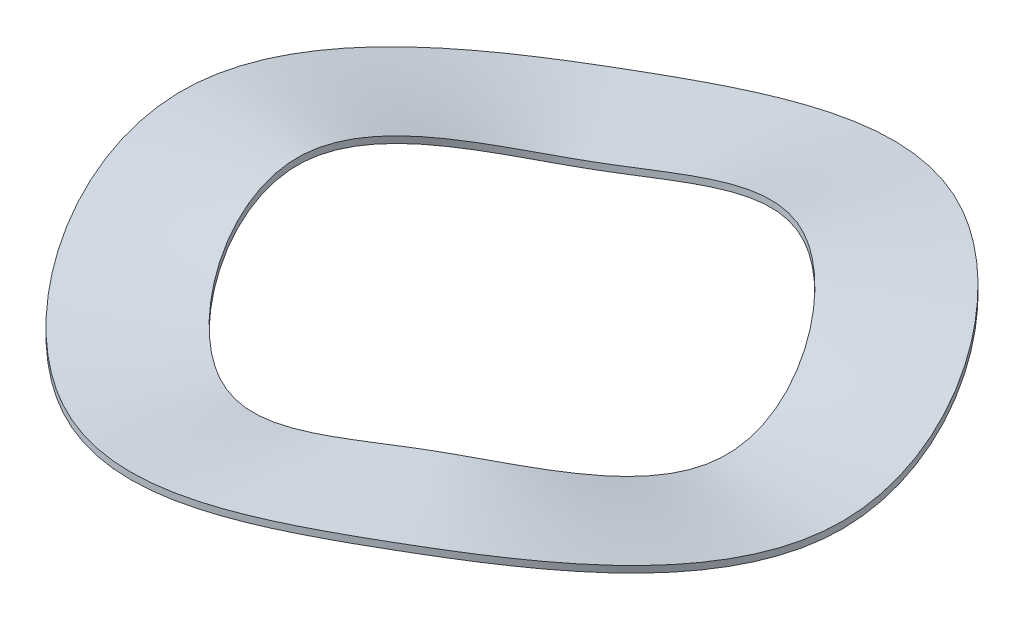
ISO-10303-21;
HEADER;
FILE_DESCRIPTION(('STEP AP214'),'2;1');
FILE_NAME('part.step','',(''),(''),'','','');
FILE_SCHEMA(('AUTOMOTIVE_DESIGN { 1 0 10303 214 1 1 1 1 }'));
ENDSEC;
DATA;
#1=APPLICATION_CONTEXT('core data for automotive mechanical design processes');
#2=APPLICATION_PROTOCOL_DEFINITION('international standard','automotive_design',2000,#1);
#3=PRODUCT_CONTEXT('',#1,'mechanical');
#4=PRODUCT('Part','Part','',(#3));
#5=PRODUCT_RELATED_PRODUCT_CATEGORY('part','',(#4));
#6=PRODUCT_DEFINITION_FORMATION('','',#4);
#7=PRODUCT_DEFINITION_CONTEXT('part definition',#1,'design');
#8=PRODUCT_DEFINITION('design','',#6,#7);
#9=PRODUCT_DEFINITION_SHAPE('','',#8);
#10=(LENGTH_UNIT() NAMED_UNIT(*) SI_UNIT(.MILLI.,.METRE.));
#11=(NAMED_UNIT(*) PLANE_ANGLE_UNIT() SI_UNIT($,.RADIAN.));
#12=(NAMED_UNIT(*) SI_UNIT($,.STERADIAN.) SOLID_ANGLE_UNIT());
#13=UNCERTAINTY_MEASURE_WITH_UNIT(LENGTH_MEASURE(1.E-05),#10,'distance_accuracy_value','');
#14=(GEOMETRIC_REPRESENTATION_CONTEXT(3) GLOBAL_UNCERTAINTY_ASSIGNED_CONTEXT((#13)) GLOBAL_UNIT_ASSIGNED_CONTEXT((#10,
#11,#12)) REPRESENTATION_CONTEXT('',''));
#15=CARTESIAN_POINT('',(0.,0.,0.));
#16=DIRECTION('',(0.,0.,1.));
#17=DIRECTION('',(1.,0.,0.));
#18=AXIS2_PLACEMENT_3D('',#15,#16,#17);
#19=CARTESIAN_POINT('',(3.25000000000006,0.745,5.62916512459881));
#20=CARTESIAN_POINT('',(5.20000000000003,0.744999999999993,4.50333209967903));
#21=CARTESIAN_POINT('',(7.79999999999999,-1.835,0.));
#22=CARTESIAN_POINT('',(3.89999999999999,2.035,-6.75499814951864));
#23=CARTESIAN_POINT('',(-3.90000000000004,-1.835,-6.75499814951861));
#24=CARTESIAN_POINT('',(-7.8,2.035,0.));
#25=CARTESIAN_POINT('',(-3.89999999999994,-1.835,6.75499814951867));
#26=CARTESIAN_POINT('',(1.30000000000007,0.745000000000006,6.75499814951861));
#27=CARTESIAN_POINT('',(3.25000000000006,0.745,5.62916512459881));
#28=CARTESIAN_POINT('',(3.83333333333341,0.745,6.63952809568065));
#29=CARTESIAN_POINT('',(6.13333333333337,0.744999999999993,5.3116224765445));
#30=CARTESIAN_POINT('',(9.19999999999998,-1.835,0.));
#31=CARTESIAN_POINT('',(4.59999999999999,2.035,-7.96743371481685));
#32=CARTESIAN_POINT('',(-4.60000000000004,-1.835,-7.96743371481682));
#33=CARTESIAN_POINT('',(-9.20000000000001,2.035,0.));
#34=CARTESIAN_POINT('',(-4.59999999999993,-1.835,7.96743371481689));
#35=CARTESIAN_POINT('',(1.53333333333342,0.745000000000006,7.96743371481682));
#36=CARTESIAN_POINT('',(3.83333333333341,0.745,6.63952809568065));
#37=CARTESIAN_POINT('',(4.41666666666675,0.745,7.64989106676249));
#38=CARTESIAN_POINT('',(7.06666666666671,0.744999999999993,6.11991285340997));
#39=CARTESIAN_POINT('',(10.6,-1.835,0.));
#40=CARTESIAN_POINT('',(5.29999999999999,2.035,-9.17986928011507));
#41=CARTESIAN_POINT('',(-5.30000000000005,-1.835,-9.17986928011503));
#42=CARTESIAN_POINT('',(-10.6,2.035,0.));
#43=CARTESIAN_POINT('',(-5.29999999999992,-1.835,9.17986928011511));
#44=CARTESIAN_POINT('',(1.76666666666676,0.745000000000006,9.17986928011503));
#45=CARTESIAN_POINT('',(4.41666666666675,0.745,7.64989106676249));
#46=CARTESIAN_POINT('',(5.0000000000001,0.745,8.66025403784433));
#47=CARTESIAN_POINT('',(8.00000000000005,0.744999999999993,6.92820323027544));
#48=CARTESIAN_POINT('',(12.,-1.835,0.));
#49=CARTESIAN_POINT('',(5.99999999999999,2.035,-10.3923048454133));
#50=CARTESIAN_POINT('',(-6.00000000000006,-1.835,-10.3923048454132));
#51=CARTESIAN_POINT('',(-12.,2.035,0.));
#52=CARTESIAN_POINT('',(-5.99999999999991,-1.835,10.3923048454133));
#53=CARTESIAN_POINT('',(2.00000000000011,0.745000000000006,10.3923048454132));
#54=CARTESIAN_POINT('',(5.0000000000001,0.745,8.66025403784433));
#55=B_SPLINE_SURFACE_WITH_KNOTS('',3,3,((#19,#20,#21,#22,#23,#24,#25,#26,#27),(#28,#29,#30,#31,
#32,#33,#34,#35,#36),(#37,#38,#39,#40,#41,#42,#43,#44,#45),(#46,#47,#48,#49,#50,#51,#52,#53,
#54)),.UNSPECIFIED.,.F.,.T.,.F.,(4,4),(4,1,1,1,1,1,4),(0.,1.),(0.,0.166666666666665,
0.333333333333332,0.499999999999999,0.666666666666666,0.833333333333333,1.),.UNSPECIFIED.);
#56=CARTESIAN_POINT('',(3.25000000000006,0.745,5.62916512459881));
#57=CARTESIAN_POINT('',(5.20000000000003,0.744999999999993,4.50333209967903));
#58=CARTESIAN_POINT('',(7.79999999999999,-1.835,0.));
#59=CARTESIAN_POINT('',(3.89999999999999,2.035,-6.75499814951864));
#60=CARTESIAN_POINT('',(-3.90000000000004,-1.835,-6.75499814951861));
#61=CARTESIAN_POINT('',(-7.8,2.035,0.));
#62=CARTESIAN_POINT('',(-3.89999999999994,-1.835,6.75499814951867));
#63=CARTESIAN_POINT('',(1.30000000000007,0.745000000000006,6.75499814951861));
#64=CARTESIAN_POINT('',(3.25000000000006,0.745,5.62916512459881));
#65=B_SPLINE_CURVE_WITH_KNOTS('',3,(#56,#57,#58,#59,#60,#61,#62,#63,#64),.UNSPECIFIED.,.T.,.F.,
(4,1,1,1,1,1,4),(0.,0.166666666666665,0.333333333333332,0.499999999999999,0.666666666666666,
0.833333333333333,1.),.UNSPECIFIED.);
#66=CARTESIAN_POINT('',(3.25000000000006,0.745,5.62916512459881));
#67=VERTEX_POINT('',#66);
#68=EDGE_CURVE('E10',#67,#67,#65,.F.);
#69=CARTESIAN_POINT('',(5.0000000000001,0.745,8.66025403784433));
#70=CARTESIAN_POINT('',(8.00000000000005,0.744999999999993,6.92820323027544));
#71=CARTESIAN_POINT('',(12.,-1.835,0.));
#72=CARTESIAN_POINT('',(5.99999999999999,2.035,-10.3923048454133));
#73=CARTESIAN_POINT('',(-6.00000000000006,-1.835,-10.3923048454132));
#74=CARTESIAN_POINT('',(-12.,2.035,0.));
#75=CARTESIAN_POINT('',(-5.99999999999991,-1.835,10.3923048454133));
#76=CARTESIAN_POINT('',(2.00000000000011,0.745000000000006,10.3923048454132));
#77=CARTESIAN_POINT('',(5.0000000000001,0.745,8.66025403784433));
#78=B_SPLINE_CURVE_WITH_KNOTS('',3,(#69,#70,#71,#72,#73,#74,#75,#76,#77),.UNSPECIFIED.,.T.,.F.,
(4,1,1,1,1,1,4),(0.,0.166666666666665,0.333333333333332,0.499999999999999,0.666666666666666,
0.833333333333333,1.),.UNSPECIFIED.);
#79=CARTESIAN_POINT('',(5.0000000000001,0.745,8.66025403784433));
#80=VERTEX_POINT('',#79);
#81=EDGE_CURVE('E373',#80,#80,#78,.T.);
#82=ORIENTED_EDGE('',*,*,#68,.T.);
#83=EDGE_LOOP('',(#82));
#84=FACE_BOUND('',#83,.T.);
#85=ORIENTED_EDGE('',*,*,#81,.T.);
#86=EDGE_LOOP('',(#85));
#87=FACE_BOUND('',#86,.T.);
#88=ADVANCED_FACE('F368',(#84,#87),#55,.T.);
#89=CARTESIAN_POINT('',(3.25000000000006,0.545,5.62916512459881));
#90=CARTESIAN_POINT('',(5.20000000000003,0.544999999999993,4.50333209967903));
#91=CARTESIAN_POINT('',(7.79999999999999,-2.035,0.));
#92=CARTESIAN_POINT('',(3.89999999999999,1.835,-6.75499814951864));
#93=CARTESIAN_POINT('',(-3.90000000000004,-2.035,-6.75499814951861));
#94=CARTESIAN_POINT('',(-7.8,1.835,0.));
#95=CARTESIAN_POINT('',(-3.89999999999994,-2.035,6.75499814951867));
#96=CARTESIAN_POINT('',(1.30000000000007,0.545000000000006,6.75499814951861));
#97=CARTESIAN_POINT('',(3.25000000000006,0.545,5.62916512459881));
#98=CARTESIAN_POINT('',(3.25000000000006,0.611666666666666,5.62916512459881));
#99=CARTESIAN_POINT('',(5.20000000000003,0.61166666666666,4.50333209967903));
#100=CARTESIAN_POINT('',(7.79999999999999,-1.96833333333333,0.));
#101=CARTESIAN_POINT('',(3.89999999999999,1.90166666666667,-6.75499814951864));
#102=CARTESIAN_POINT('',(-3.90000000000004,-1.96833333333334,-6.75499814951861));
#103=CARTESIAN_POINT('',(-7.8,1.90166666666667,0.));
#104=CARTESIAN_POINT('',(-3.89999999999994,-1.96833333333334,6.75499814951867));
#105=CARTESIAN_POINT('',(1.30000000000007,0.611666666666673,6.75499814951861));
#106=CARTESIAN_POINT('',(3.25000000000006,0.611666666666666,5.62916512459881));
#107=CARTESIAN_POINT('',(3.25000000000006,0.678333333333333,5.62916512459881));
#108=CARTESIAN_POINT('',(5.20000000000003,0.678333333333326,4.50333209967903));
#109=CARTESIAN_POINT('',(7.79999999999999,-1.90166666666666,0.));
#110=CARTESIAN_POINT('',(3.89999999999999,1.96833333333334,-6.75499814951864));
#111=CARTESIAN_POINT('',(-3.90000000000004,-1.90166666666667,-6.75499814951861));
#112=CARTESIAN_POINT('',(-7.8,1.96833333333333,0.));
#113=CARTESIAN_POINT('',(-3.89999999999994,-1.90166666666667,6.75499814951867));
#114=CARTESIAN_POINT('',(1.30000000000007,0.678333333333339,6.75499814951861));
#115=CARTESIAN_POINT('',(3.25000000000006,0.678333333333333,5.62916512459881));
#116=CARTESIAN_POINT('',(3.25000000000006,0.745,5.62916512459881));
#117=CARTESIAN_POINT('',(5.20000000000003,0.744999999999993,4.50333209967903));
#118=CARTESIAN_POINT('',(7.79999999999999,-1.835,0.));
#119=CARTESIAN_POINT('',(3.89999999999999,2.035,-6.75499814951864));
#120=CARTESIAN_POINT('',(-3.90000000000004,-1.835,-6.75499814951861));
#121=CARTESIAN_POINT('',(-7.8,2.035,0.));
#122=CARTESIAN_POINT('',(-3.89999999999994,-1.835,6.75499814951867));
#123=CARTESIAN_POINT('',(1.30000000000007,0.745000000000006,6.75499814951861));
#124=CARTESIAN_POINT('',(3.25000000000006,0.745,5.62916512459881));
#125=B_SPLINE_SURFACE_WITH_KNOTS('',3,3,((#89,#90,#91,#92,#93,#94,#95,#96,#97),(#98,#99,#100,
#101,#102,#103,#104,#105,#106),(#107,#108,#109,#110,#111,#112,#113,#114,#115),(#116,#117,#118,
#119,#120,#121,#122,#123,#124)),.UNSPECIFIED.,.F.,.T.,.F.,(4,4),(4,1,1,1,1,1,4),(0.,1.),(0.,
0.166666666666665,0.333333333333332,0.499999999999999,0.666666666666666,0.833333333333333,1.),.UNSPECIFIED.);
#126=CARTESIAN_POINT('',(3.25000000000006,0.545,5.62916512459881));
#127=CARTESIAN_POINT('',(5.20000000000003,0.544999999999993,4.50333209967903));
#128=CARTESIAN_POINT('',(7.79999999999999,-2.035,0.));
#129=CARTESIAN_POINT('',(3.89999999999999,1.835,-6.75499814951864));
#130=CARTESIAN_POINT('',(-3.90000000000004,-2.035,-6.75499814951861));
#131=CARTESIAN_POINT('',(-7.8,1.835,0.));
#132=CARTESIAN_POINT('',(-3.89999999999994,-2.035,6.75499814951867));
#133=CARTESIAN_POINT('',(1.30000000000007,0.545000000000006,6.75499814951861));
#134=CARTESIAN_POINT('',(3.25000000000006,0.545,5.62916512459881));
#135=B_SPLINE_CURVE_WITH_KNOTS('',3,(#126,#127,#128,#129,#130,#131,#132,#133,#134),
.UNSPECIFIED.,.T.,.F.,(4,1,1,1,1,1,4),(0.,0.166666666666665,0.333333333333332,0.499999999999999,
0.666666666666666,0.833333333333333,1.),.UNSPECIFIED.);
#136=CARTESIAN_POINT('',(3.25000000000006,0.545,5.62916512459881));
#137=VERTEX_POINT('',#136);
#138=EDGE_CURVE('E393',#137,#137,#135,.T.);
#139=ORIENTED_EDGE('',*,*,#138,.F.);
#140=EDGE_LOOP('',(#139));
#141=FACE_BOUND('',#140,.T.);
#142=ORIENTED_EDGE('',*,*,#68,.F.);
#143=EDGE_LOOP('',(#142));
#144=FACE_BOUND('',#143,.T.);
#145=ADVANCED_FACE('F407',(#141,#144),#125,.T.);
#146=CARTESIAN_POINT('',(5.0000000000001,0.745,8.66025403784433));
#147=CARTESIAN_POINT('',(8.00000000000005,0.744999999999993,6.92820323027543));
#148=CARTESIAN_POINT('',(12.,-1.835,0.));
#149=CARTESIAN_POINT('',(5.99999999999998,2.035,-10.3923048454133));
#150=CARTESIAN_POINT('',(-6.00000000000006,-1.835,-10.3923048454132));
#151=CARTESIAN_POINT('',(-12.,2.035,0.));
#152=CARTESIAN_POINT('',(-5.99999999999991,-1.835,10.3923048454133));
#153=CARTESIAN_POINT('',(2.00000000000011,0.745000000000006,10.3923048454132));
#154=CARTESIAN_POINT('',(5.0000000000001,0.745,8.66025403784433));
#155=CARTESIAN_POINT('',(5.0000000000001,0.678333333333333,8.66025403784433));
#156=CARTESIAN_POINT('',(8.00000000000005,0.678333333333326,6.92820323027543));
#157=CARTESIAN_POINT('',(12.,-1.90166666666666,0.));
#158=CARTESIAN_POINT('',(5.99999999999998,1.96833333333334,-10.3923048454133));
#159=CARTESIAN_POINT('',(-6.00000000000006,-1.90166666666667,-10.3923048454132));
#160=CARTESIAN_POINT('',(-12.,1.96833333333333,0.));
#161=CARTESIAN_POINT('',(-5.99999999999991,-1.90166666666667,10.3923048454133));
#162=CARTESIAN_POINT('',(2.00000000000011,0.678333333333339,10.3923048454132));
#163=CARTESIAN_POINT('',(5.0000000000001,0.678333333333333,8.66025403784433));
#164=CARTESIAN_POINT('',(5.0000000000001,0.611666666666666,8.66025403784433));
#165=CARTESIAN_POINT('',(8.00000000000005,0.61166666666666,6.92820323027543));
#166=CARTESIAN_POINT('',(12.,-1.96833333333333,0.));
#167=CARTESIAN_POINT('',(5.99999999999998,1.90166666666667,-10.3923048454133));
#168=CARTESIAN_POINT('',(-6.00000000000006,-1.96833333333334,-10.3923048454132));
#169=CARTESIAN_POINT('',(-12.,1.90166666666667,0.));
#170=CARTESIAN_POINT('',(-5.99999999999991,-1.96833333333334,10.3923048454133));
#171=CARTESIAN_POINT('',(2.00000000000011,0.611666666666673,10.3923048454132));
#172=CARTESIAN_POINT('',(5.0000000000001,0.611666666666666,8.66025403784433));
#173=CARTESIAN_POINT('',(5.0000000000001,0.545,8.66025403784433));
#174=CARTESIAN_POINT('',(8.00000000000005,0.544999999999993,6.92820323027543));
#175=CARTESIAN_POINT('',(12.,-2.035,0.));
#176=CARTESIAN_POINT('',(5.99999999999998,1.835,-10.3923048454133));
#177=CARTESIAN_POINT('',(-6.00000000000006,-2.035,-10.3923048454132));
#178=CARTESIAN_POINT('',(-12.,1.835,0.));
#179=CARTESIAN_POINT('',(-5.99999999999991,-2.035,10.3923048454133));
#180=CARTESIAN_POINT('',(2.00000000000011,0.545000000000006,10.3923048454132));
#181=CARTESIAN_POINT('',(5.0000000000001,0.545,8.66025403784433));
#182=B_SPLINE_SURFACE_WITH_KNOTS('',3,3,((#146,#147,#148,#149,#150,#151,#152,#153,#154),(#155,
#156,#157,#158,#159,#160,#161,#162,#163),(#164,#165,#166,#167,#168,#169,#170,#171,#172),(#173,
#174,#175,#176,#177,#178,#179,#180,#181)),.UNSPECIFIED.,.F.,.T.,.F.,(4,4),(4,1,1,1,1,1,4),(0.,
1.),(0.,0.166666666666665,0.333333333333332,0.499999999999999,0.666666666666666,
0.833333333333333,1.),.UNSPECIFIED.);
#183=CARTESIAN_POINT('',(5.0000000000001,0.545,8.66025403784433));
#184=CARTESIAN_POINT('',(8.00000000000005,0.544999999999993,6.92820323027543));
#185=CARTESIAN_POINT('',(12.,-2.035,0.));
#186=CARTESIAN_POINT('',(5.99999999999998,1.835,-10.3923048454133));
#187=CARTESIAN_POINT('',(-6.00000000000006,-2.035,-10.3923048454132));
#188=CARTESIAN_POINT('',(-12.,1.835,0.));
#189=CARTESIAN_POINT('',(-5.99999999999991,-2.035,10.3923048454133));
#190=CARTESIAN_POINT('',(2.00000000000011,0.545000000000006,10.3923048454132));
#191=CARTESIAN_POINT('',(5.0000000000001,0.545,8.66025403784433));
#192=B_SPLINE_CURVE_WITH_KNOTS('',3,(#183,#184,#185,#186,#187,#188,#189,#190,#191),
.UNSPECIFIED.,.T.,.F.,(4,1,1,1,1,1,4),(0.,0.166666666666665,0.333333333333332,0.499999999999999,
0.666666666666666,0.833333333333333,1.),.UNSPECIFIED.);
#193=CARTESIAN_POINT('',(5.0000000000001,0.545,8.66025403784433));
#194=VERTEX_POINT('',#193);
#195=EDGE_CURVE('E382',#194,#194,#192,.T.);
#196=ORIENTED_EDGE('',*,*,#81,.F.);
#197=EDGE_LOOP('',(#196));
#198=FACE_BOUND('',#197,.T.);
#199=ORIENTED_EDGE('',*,*,#195,.T.);
#200=EDGE_LOOP('',(#199));
#201=FACE_BOUND('',#200,.T.);
#202=ADVANCED_FACE('F410',(#198,#201),#182,.T.);
#203=CARTESIAN_POINT('',(5.0000000000001,0.544999999999999,8.66025403784433));
#204=CARTESIAN_POINT('',(8.00000000000005,0.544999999999993,6.92820323027544));
#205=CARTESIAN_POINT('',(12.,-2.035,0.));
#206=CARTESIAN_POINT('',(5.99999999999999,1.835,-10.3923048454133));
#207=CARTESIAN_POINT('',(-6.00000000000006,-2.035,-10.3923048454132));
#208=CARTESIAN_POINT('',(-12.,1.835,0.));
#209=CARTESIAN_POINT('',(-5.99999999999991,-2.035,10.3923048454133));
#210=CARTESIAN_POINT('',(2.00000000000011,0.545000000000006,10.3923048454132));
#211=CARTESIAN_POINT('',(5.0000000000001,0.544999999999999,8.66025403784433));
#212=CARTESIAN_POINT('',(4.41666666666675,0.544999999999999,7.64989106676249));
#213=CARTESIAN_POINT('',(7.06666666666671,0.544999999999993,6.11991285340997));
#214=CARTESIAN_POINT('',(10.6,-2.035,0.));
#215=CARTESIAN_POINT('',(5.29999999999999,1.835,-9.17986928011507));
#216=CARTESIAN_POINT('',(-5.30000000000005,-2.035,-9.17986928011503));
#217=CARTESIAN_POINT('',(-10.6,1.835,0.));
#218=CARTESIAN_POINT('',(-5.29999999999992,-2.035,9.17986928011511));
#219=CARTESIAN_POINT('',(1.76666666666676,0.545000000000006,9.17986928011503));
#220=CARTESIAN_POINT('',(4.41666666666675,0.544999999999999,7.64989106676249));
#221=CARTESIAN_POINT('',(3.83333333333341,0.545,6.63952809568065));
#222=CARTESIAN_POINT('',(6.13333333333337,0.544999999999993,5.3116224765445));
#223=CARTESIAN_POINT('',(9.19999999999998,-2.035,0.));
#224=CARTESIAN_POINT('',(4.59999999999999,1.835,-7.96743371481685));
#225=CARTESIAN_POINT('',(-4.60000000000004,-2.035,-7.96743371481682));
#226=CARTESIAN_POINT('',(-9.20000000000001,1.835,0.));
#227=CARTESIAN_POINT('',(-4.59999999999993,-2.035,7.96743371481689));
#228=CARTESIAN_POINT('',(1.53333333333342,0.545000000000006,7.96743371481682));
#229=CARTESIAN_POINT('',(3.83333333333341,0.545,6.63952809568065));
#230=CARTESIAN_POINT('',(3.25000000000006,0.545,5.62916512459881));
#231=CARTESIAN_POINT('',(5.20000000000003,0.544999999999993,4.50333209967903));
#232=CARTESIAN_POINT('',(7.79999999999999,-2.035,0.));
#233=CARTESIAN_POINT('',(3.89999999999999,1.835,-6.75499814951864));
#234=CARTESIAN_POINT('',(-3.90000000000004,-2.035,-6.75499814951861));
#235=CARTESIAN_POINT('',(-7.8,1.835,0.));
#236=CARTESIAN_POINT('',(-3.89999999999994,-2.035,6.75499814951867));
#237=CARTESIAN_POINT('',(1.30000000000007,0.545000000000006,6.75499814951861));
#238=CARTESIAN_POINT('',(3.25000000000006,0.545,5.62916512459881));
#239=B_SPLINE_SURFACE_WITH_KNOTS('',3,3,((#203,#204,#205,#206,#207,#208,#209,#210,#211),(#212,
#213,#214,#215,#216,#217,#218,#219,#220),(#221,#222,#223,#224,#225,#226,#227,#228,#229),(#230,
#231,#232,#233,#234,#235,#236,#237,#238)),.UNSPECIFIED.,.F.,.T.,.F.,(4,4),(4,1,1,1,1,1,4),(0.,
1.),(0.,0.166666666666665,0.333333333333332,0.499999999999999,0.666666666666666,
0.833333333333333,1.),.UNSPECIFIED.);
#240=ORIENTED_EDGE('',*,*,#195,.F.);
#241=EDGE_LOOP('',(#240));
#242=FACE_BOUND('',#241,.T.);
#243=ORIENTED_EDGE('',*,*,#138,.T.);
#244=EDGE_LOOP('',(#243));
#245=FACE_BOUND('',#244,.T.);
#246=ADVANCED_FACE('F405',(#242,#245),#239,.T.);
#247=CLOSED_SHELL('',(#88,#145,#202,#246));
#248=MANIFOLD_SOLID_BREP('B2',#247);
#249=ADVANCED_BREP_SHAPE_REPRESENTATION('',(#18,#248),#14);
#250=SHAPE_DEFINITION_REPRESENTATION(#9,#249);
ENDSEC;
END-ISO-10303-21;
